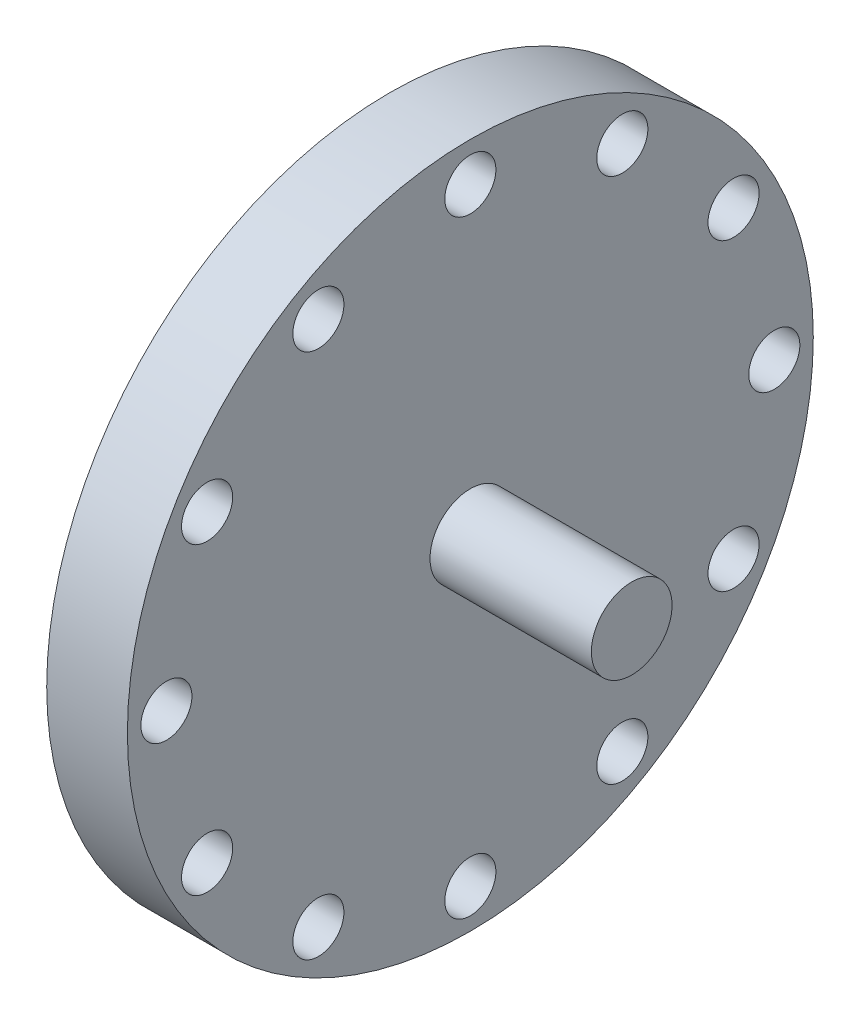
ISO-10303-21;
HEADER;
FILE_DESCRIPTION(('STEP AP214'),'2;1');
FILE_NAME('part.step','',(''),(''),'','','');
FILE_SCHEMA(('AUTOMOTIVE_DESIGN { 1 0 10303 214 1 1 1 1 }'));
ENDSEC;
DATA;
#1=APPLICATION_CONTEXT('core data for automotive mechanical design processes');
#2=APPLICATION_PROTOCOL_DEFINITION('international standard','automotive_design',2000,#1);
#3=PRODUCT_CONTEXT('',#1,'mechanical');
#4=PRODUCT('Part','Part','',(#3));
#5=PRODUCT_RELATED_PRODUCT_CATEGORY('part','',(#4));
#6=PRODUCT_DEFINITION_FORMATION('','',#4);
#7=PRODUCT_DEFINITION_CONTEXT('part definition',#1,'design');
#8=PRODUCT_DEFINITION('design','',#6,#7);
#9=PRODUCT_DEFINITION_SHAPE('','',#8);
#10=(LENGTH_UNIT() NAMED_UNIT(*) SI_UNIT(.MILLI.,.METRE.));
#11=(NAMED_UNIT(*) PLANE_ANGLE_UNIT() SI_UNIT($,.RADIAN.));
#12=(NAMED_UNIT(*) SI_UNIT($,.STERADIAN.) SOLID_ANGLE_UNIT());
#13=UNCERTAINTY_MEASURE_WITH_UNIT(LENGTH_MEASURE(1.E-05),#10,'distance_accuracy_value','');
#14=(GEOMETRIC_REPRESENTATION_CONTEXT(3) GLOBAL_UNCERTAINTY_ASSIGNED_CONTEXT((#13)) GLOBAL_UNIT_ASSIGNED_CONTEXT((#10,
#11,#12)) REPRESENTATION_CONTEXT('',''));
#15=CARTESIAN_POINT('',(0.,0.,0.));
#16=DIRECTION('',(0.,0.,1.));
#17=DIRECTION('',(1.,0.,0.));
#18=AXIS2_PLACEMENT_3D('',#15,#16,#17);
#19=CARTESIAN_POINT('',(0.,0.,0.));
#20=DIRECTION('',(1.,0.,0.));
#21=DIRECTION('',(0.,0.,-1.));
#22=AXIS2_PLACEMENT_3D('',#19,#20,#21);
#23=PLANE('',#22);
#24=CARTESIAN_POINT('',(0.,0.,0.));
#25=DIRECTION('',(-1.,0.,0.));
#26=DIRECTION('',(0.,0.,1.));
#27=AXIS2_PLACEMENT_3D('',#24,#25,#26);
#28=CIRCLE('',#27,20.);
#29=CARTESIAN_POINT('',(0.,0.,20.));
#30=VERTEX_POINT('',#29);
#31=EDGE_CURVE('E10',#30,#30,#28,.T.);
#32=ORIENTED_EDGE('',*,*,#31,.T.);
#33=EDGE_LOOP('',(#32));
#34=FACE_BOUND('',#33,.T.);
#35=ADVANCED_FACE('F37',(#34),#23,.F.);
#36=CARTESIAN_POINT('',(0.,0.,0.));
#37=DIRECTION('',(-1.,0.,0.));
#38=DIRECTION('',(0.,0.,1.));
#39=AXIS2_PLACEMENT_3D('',#36,#37,#38);
#40=CYLINDRICAL_SURFACE('',#39,20.);
#41=ORIENTED_EDGE('',*,*,#31,.F.);
#42=EDGE_LOOP('',(#41));
#43=FACE_BOUND('',#42,.T.);
#44=CARTESIAN_POINT('',(10.,0.,0.));
#45=DIRECTION('',(-1.,0.,0.));
#46=DIRECTION('',(0.,0.,1.));
#47=AXIS2_PLACEMENT_3D('',#44,#45,#46);
#48=CIRCLE('',#47,20.);
#49=CARTESIAN_POINT('',(10.,0.,20.));
#50=VERTEX_POINT('',#49);
#51=EDGE_CURVE('E44',#50,#50,#48,.T.);
#52=ORIENTED_EDGE('',*,*,#51,.T.);
#53=EDGE_LOOP('',(#52));
#54=FACE_BOUND('',#53,.T.);
#55=ADVANCED_FACE('F169',(#43,#54),#40,.T.);
#56=CARTESIAN_POINT('',(10.,20.,0.));
#57=DIRECTION('',(1.,0.,0.));
#58=DIRECTION('',(0.,0.,-1.));
#59=AXIS2_PLACEMENT_3D('',#56,#57,#58);
#60=PLANE('',#59);
#61=CARTESIAN_POINT('',(9.99999999999999,97.8608706276416,-56.5));
#62=DIRECTION('',(1.,0.,0.));
#63=DIRECTION('',(0.,0.,-1.));
#64=AXIS2_PLACEMENT_3D('',#61,#62,#63);
#65=CIRCLE('',#64,9.50000000000001);
#66=CARTESIAN_POINT('',(9.99999999999999,97.8608706276416,-66.));
#67=VERTEX_POINT('',#66);
#68=EDGE_CURVE('E95',#67,#67,#65,.F.);
#69=ORIENTED_EDGE('',*,*,#68,.F.);
#70=EDGE_LOOP('',(#69));
#71=FACE_BOUND('',#70,.T.);
#72=CARTESIAN_POINT('',(9.99999999999999,56.4999999999999,-97.8608706276416));
#73=DIRECTION('',(1.,0.,0.));
#74=DIRECTION('',(0.,0.,-1.));
#75=AXIS2_PLACEMENT_3D('',#72,#73,#74);
#76=CIRCLE('',#75,9.5);
#77=CARTESIAN_POINT('',(9.99999999999999,56.4999999999999,-107.360870627642));
#78=VERTEX_POINT('',#77);
#79=EDGE_CURVE('E92',#78,#78,#76,.F.);
#80=ORIENTED_EDGE('',*,*,#79,.F.);
#81=EDGE_LOOP('',(#80));
#82=FACE_BOUND('',#81,.T.);
#83=CARTESIAN_POINT('',(9.99999999999999,0.,-113.));
#84=DIRECTION('',(1.,0.,0.));
#85=DIRECTION('',(0.,0.,-1.));
#86=AXIS2_PLACEMENT_3D('',#83,#84,#85);
#87=CIRCLE('',#86,9.49999999999999);
#88=CARTESIAN_POINT('',(9.99999999999999,0.,-122.5));
#89=VERTEX_POINT('',#88);
#90=EDGE_CURVE('E89',#89,#89,#87,.F.);
#91=ORIENTED_EDGE('',*,*,#90,.F.);
#92=EDGE_LOOP('',(#91));
#93=FACE_BOUND('',#92,.T.);
#94=CARTESIAN_POINT('',(9.99999999999999,-56.5,-97.8608706276415));
#95=DIRECTION('',(1.,0.,0.));
#96=DIRECTION('',(0.,0.,-1.));
#97=AXIS2_PLACEMENT_3D('',#94,#95,#96);
#98=CIRCLE('',#97,9.5);
#99=CARTESIAN_POINT('',(9.99999999999999,-56.5,-107.360870627642));
#100=VERTEX_POINT('',#99);
#101=EDGE_CURVE('E85',#100,#100,#98,.F.);
#102=ORIENTED_EDGE('',*,*,#101,.F.);
#103=EDGE_LOOP('',(#102));
#104=FACE_BOUND('',#103,.T.);
#105=CARTESIAN_POINT('',(9.99999999999999,-97.8608706276416,-56.5));
#106=DIRECTION('',(1.,0.,0.));
#107=DIRECTION('',(0.,0.,-1.));
#108=AXIS2_PLACEMENT_3D('',#105,#106,#107);
#109=CIRCLE('',#108,9.50000000000001);
#110=CARTESIAN_POINT('',(9.99999999999999,-97.8608706276416,-66.));
#111=VERTEX_POINT('',#110);
#112=EDGE_CURVE('E81',#111,#111,#109,.F.);
#113=ORIENTED_EDGE('',*,*,#112,.F.);
#114=EDGE_LOOP('',(#113));
#115=FACE_BOUND('',#114,.T.);
#116=CARTESIAN_POINT('',(9.99999999999999,-113.,0.));
#117=DIRECTION('',(1.,0.,0.));
#118=DIRECTION('',(0.,0.,-1.));
#119=AXIS2_PLACEMENT_3D('',#116,#117,#118);
#120=CIRCLE('',#119,9.49999999999998);
#121=CARTESIAN_POINT('',(9.99999999999999,-113.,-9.49999999999998));
#122=VERTEX_POINT('',#121);
#123=EDGE_CURVE('E77',#122,#122,#120,.F.);
#124=ORIENTED_EDGE('',*,*,#123,.F.);
#125=EDGE_LOOP('',(#124));
#126=FACE_BOUND('',#125,.T.);
#127=CARTESIAN_POINT('',(9.99999999999999,-97.8608706276415,56.5));
#128=DIRECTION('',(1.,0.,0.));
#129=DIRECTION('',(0.,0.,-1.));
#130=AXIS2_PLACEMENT_3D('',#127,#128,#129);
#131=CIRCLE('',#130,9.5);
#132=CARTESIAN_POINT('',(9.99999999999999,-97.8608706276415,47.));
#133=VERTEX_POINT('',#132);
#134=EDGE_CURVE('E73',#133,#133,#131,.F.);
#135=ORIENTED_EDGE('',*,*,#134,.F.);
#136=EDGE_LOOP('',(#135));
#137=FACE_BOUND('',#136,.T.);
#138=CARTESIAN_POINT('',(9.99999999999999,-56.5,97.8608706276416));
#139=DIRECTION('',(1.,0.,0.));
#140=DIRECTION('',(0.,0.,-1.));
#141=AXIS2_PLACEMENT_3D('',#138,#139,#140);
#142=CIRCLE('',#141,9.5);
#143=CARTESIAN_POINT('',(9.99999999999999,-56.5,88.3608706276416));
#144=VERTEX_POINT('',#143);
#145=EDGE_CURVE('E69',#144,#144,#142,.F.);
#146=ORIENTED_EDGE('',*,*,#145,.F.);
#147=EDGE_LOOP('',(#146));
#148=FACE_BOUND('',#147,.T.);
#149=CARTESIAN_POINT('',(9.99999999999999,0.,113.));
#150=DIRECTION('',(1.,0.,0.));
#151=DIRECTION('',(0.,0.,-1.));
#152=AXIS2_PLACEMENT_3D('',#149,#150,#151);
#153=CIRCLE('',#152,9.49999999999999);
#154=CARTESIAN_POINT('',(9.99999999999999,0.,103.5));
#155=VERTEX_POINT('',#154);
#156=EDGE_CURVE('E65',#155,#155,#153,.F.);
#157=ORIENTED_EDGE('',*,*,#156,.F.);
#158=EDGE_LOOP('',(#157));
#159=FACE_BOUND('',#158,.T.);
#160=CARTESIAN_POINT('',(9.99999999999999,56.5,97.8608706276416));
#161=DIRECTION('',(1.,0.,0.));
#162=DIRECTION('',(0.,0.,-1.));
#163=AXIS2_PLACEMENT_3D('',#160,#161,#162);
#164=CIRCLE('',#163,9.5);
#165=CARTESIAN_POINT('',(9.99999999999999,56.5,88.3608706276416));
#166=VERTEX_POINT('',#165);
#167=EDGE_CURVE('E61',#166,#166,#164,.F.);
#168=ORIENTED_EDGE('',*,*,#167,.F.);
#169=EDGE_LOOP('',(#168));
#170=FACE_BOUND('',#169,.T.);
#171=CARTESIAN_POINT('',(9.99999999999999,97.8608706276416,56.5));
#172=DIRECTION('',(1.,0.,0.));
#173=DIRECTION('',(0.,0.,-1.));
#174=AXIS2_PLACEMENT_3D('',#171,#172,#173);
#175=CIRCLE('',#174,9.5);
#176=CARTESIAN_POINT('',(9.99999999999999,97.8608706276416,47.));
#177=VERTEX_POINT('',#176);
#178=EDGE_CURVE('E57',#177,#177,#175,.F.);
#179=ORIENTED_EDGE('',*,*,#178,.F.);
#180=EDGE_LOOP('',(#179));
#181=FACE_BOUND('',#180,.T.);
#182=CARTESIAN_POINT('',(9.99999999999999,113.,0.));
#183=DIRECTION('',(1.,0.,0.));
#184=DIRECTION('',(0.,0.,-1.));
#185=AXIS2_PLACEMENT_3D('',#182,#183,#184);
#186=CIRCLE('',#185,9.50000000000001);
#187=CARTESIAN_POINT('',(9.99999999999999,113.,-9.50000000000001));
#188=VERTEX_POINT('',#187);
#189=EDGE_CURVE('E56',#188,#188,#186,.F.);
#190=ORIENTED_EDGE('',*,*,#189,.F.);
#191=EDGE_LOOP('',(#190));
#192=FACE_BOUND('',#191,.T.);
#193=ORIENTED_EDGE('',*,*,#51,.F.);
#194=EDGE_LOOP('',(#193));
#195=FACE_BOUND('',#194,.T.);
#196=CARTESIAN_POINT('',(10.,0.,0.));
#197=DIRECTION('',(-1.,0.,0.));
#198=DIRECTION('',(0.,0.,1.));
#199=AXIS2_PLACEMENT_3D('',#196,#197,#198);
#200=CIRCLE('',#199,127.5);
#201=CARTESIAN_POINT('',(10.,0.,127.5));
#202=VERTEX_POINT('',#201);
#203=EDGE_CURVE('E49',#202,#202,#200,.T.);
#204=ORIENTED_EDGE('',*,*,#203,.T.);
#205=EDGE_LOOP('',(#204));
#206=FACE_BOUND('',#205,.T.);
#207=ADVANCED_FACE('F137',(#71,#82,#93,#104,#115,#126,#137,#148,#159,#170,#181,#192,#195,#206),
#60,.F.);
#208=CARTESIAN_POINT('',(0.,0.,0.));
#209=DIRECTION('',(-1.,0.,0.));
#210=DIRECTION('',(0.,0.,1.));
#211=AXIS2_PLACEMENT_3D('',#208,#209,#210);
#212=CYLINDRICAL_SURFACE('',#211,127.5);
#213=ORIENTED_EDGE('',*,*,#203,.F.);
#214=EDGE_LOOP('',(#213));
#215=FACE_BOUND('',#214,.T.);
#216=CARTESIAN_POINT('',(40.,0.,0.));
#217=DIRECTION('',(-1.,0.,0.));
#218=DIRECTION('',(0.,0.,1.));
#219=AXIS2_PLACEMENT_3D('',#216,#217,#218);
#220=CIRCLE('',#219,127.5);
#221=CARTESIAN_POINT('',(40.,0.,127.5));
#222=VERTEX_POINT('',#221);
#223=EDGE_CURVE('E132',#222,#222,#220,.T.);
#224=ORIENTED_EDGE('',*,*,#223,.T.);
#225=EDGE_LOOP('',(#224));
#226=FACE_BOUND('',#225,.T.);
#227=ADVANCED_FACE('F139',(#215,#226),#212,.T.);
#228=CARTESIAN_POINT('',(40.,127.5,0.));
#229=DIRECTION('',(-1.,0.,0.));
#230=DIRECTION('',(0.,0.,1.));
#231=AXIS2_PLACEMENT_3D('',#228,#229,#230);
#232=PLANE('',#231);
#233=CARTESIAN_POINT('',(40.,97.8608706276416,-56.5));
#234=DIRECTION('',(-1.,0.,0.));
#235=DIRECTION('',(0.,0.,1.));
#236=AXIS2_PLACEMENT_3D('',#233,#234,#235);
#237=CIRCLE('',#236,9.50000000000001);
#238=CARTESIAN_POINT('',(40.,97.8608706276416,-47.));
#239=VERTEX_POINT('',#238);
#240=EDGE_CURVE('E40',#239,#239,#237,.F.);
#241=ORIENTED_EDGE('',*,*,#240,.F.);
#242=EDGE_LOOP('',(#241));
#243=FACE_BOUND('',#242,.T.);
#244=CARTESIAN_POINT('',(40.,56.4999999999999,-97.8608706276416));
#245=DIRECTION('',(-1.,0.,0.));
#246=DIRECTION('',(0.,0.,1.));
#247=AXIS2_PLACEMENT_3D('',#244,#245,#246);
#248=CIRCLE('',#247,9.5);
#249=CARTESIAN_POINT('',(40.,56.4999999999999,-88.3608706276416));
#250=VERTEX_POINT('',#249);
#251=EDGE_CURVE('E93',#250,#250,#248,.F.);
#252=ORIENTED_EDGE('',*,*,#251,.F.);
#253=EDGE_LOOP('',(#252));
#254=FACE_BOUND('',#253,.T.);
#255=CARTESIAN_POINT('',(40.,0.,-113.));
#256=DIRECTION('',(-1.,0.,0.));
#257=DIRECTION('',(0.,0.,1.));
#258=AXIS2_PLACEMENT_3D('',#255,#256,#257);
#259=CIRCLE('',#258,9.49999999999999);
#260=CARTESIAN_POINT('',(40.,0.,-103.5));
#261=VERTEX_POINT('',#260);
#262=EDGE_CURVE('E90',#261,#261,#259,.F.);
#263=ORIENTED_EDGE('',*,*,#262,.F.);
#264=EDGE_LOOP('',(#263));
#265=FACE_BOUND('',#264,.T.);
#266=CARTESIAN_POINT('',(40.,-56.5,-97.8608706276415));
#267=DIRECTION('',(-1.,0.,0.));
#268=DIRECTION('',(0.,0.,1.));
#269=AXIS2_PLACEMENT_3D('',#266,#267,#268);
#270=CIRCLE('',#269,9.5);
#271=CARTESIAN_POINT('',(40.,-56.5,-88.3608706276415));
#272=VERTEX_POINT('',#271);
#273=EDGE_CURVE('E86',#272,#272,#270,.F.);
#274=ORIENTED_EDGE('',*,*,#273,.F.);
#275=EDGE_LOOP('',(#274));
#276=FACE_BOUND('',#275,.T.);
#277=CARTESIAN_POINT('',(40.,-97.8608706276416,-56.5));
#278=DIRECTION('',(-1.,0.,0.));
#279=DIRECTION('',(0.,0.,1.));
#280=AXIS2_PLACEMENT_3D('',#277,#278,#279);
#281=CIRCLE('',#280,9.50000000000001);
#282=CARTESIAN_POINT('',(40.,-97.8608706276416,-47.));
#283=VERTEX_POINT('',#282);
#284=EDGE_CURVE('E82',#283,#283,#281,.F.);
#285=ORIENTED_EDGE('',*,*,#284,.F.);
#286=EDGE_LOOP('',(#285));
#287=FACE_BOUND('',#286,.T.);
#288=CARTESIAN_POINT('',(40.,-113.,0.));
#289=DIRECTION('',(-1.,0.,0.));
#290=DIRECTION('',(0.,0.,1.));
#291=AXIS2_PLACEMENT_3D('',#288,#289,#290);
#292=CIRCLE('',#291,9.49999999999998);
#293=CARTESIAN_POINT('',(40.,-113.,9.49999999999998));
#294=VERTEX_POINT('',#293);
#295=EDGE_CURVE('E78',#294,#294,#292,.F.);
#296=ORIENTED_EDGE('',*,*,#295,.F.);
#297=EDGE_LOOP('',(#296));
#298=FACE_BOUND('',#297,.T.);
#299=CARTESIAN_POINT('',(40.,-97.8608706276415,56.5));
#300=DIRECTION('',(-1.,0.,0.));
#301=DIRECTION('',(0.,0.,1.));
#302=AXIS2_PLACEMENT_3D('',#299,#300,#301);
#303=CIRCLE('',#302,9.5);
#304=CARTESIAN_POINT('',(40.,-97.8608706276415,66.));
#305=VERTEX_POINT('',#304);
#306=EDGE_CURVE('E74',#305,#305,#303,.F.);
#307=ORIENTED_EDGE('',*,*,#306,.F.);
#308=EDGE_LOOP('',(#307));
#309=FACE_BOUND('',#308,.T.);
#310=CARTESIAN_POINT('',(40.,-56.5,97.8608706276416));
#311=DIRECTION('',(-1.,0.,0.));
#312=DIRECTION('',(0.,0.,1.));
#313=AXIS2_PLACEMENT_3D('',#310,#311,#312);
#314=CIRCLE('',#313,9.5);
#315=CARTESIAN_POINT('',(40.,-56.5,107.360870627642));
#316=VERTEX_POINT('',#315);
#317=EDGE_CURVE('E70',#316,#316,#314,.F.);
#318=ORIENTED_EDGE('',*,*,#317,.F.);
#319=EDGE_LOOP('',(#318));
#320=FACE_BOUND('',#319,.T.);
#321=CARTESIAN_POINT('',(40.,0.,113.));
#322=DIRECTION('',(-1.,0.,0.));
#323=DIRECTION('',(0.,0.,1.));
#324=AXIS2_PLACEMENT_3D('',#321,#322,#323);
#325=CIRCLE('',#324,9.49999999999999);
#326=CARTESIAN_POINT('',(40.,0.,122.5));
#327=VERTEX_POINT('',#326);
#328=EDGE_CURVE('E66',#327,#327,#325,.F.);
#329=ORIENTED_EDGE('',*,*,#328,.F.);
#330=EDGE_LOOP('',(#329));
#331=FACE_BOUND('',#330,.T.);
#332=CARTESIAN_POINT('',(40.,56.5,97.8608706276416));
#333=DIRECTION('',(-1.,0.,0.));
#334=DIRECTION('',(0.,0.,1.));
#335=AXIS2_PLACEMENT_3D('',#332,#333,#334);
#336=CIRCLE('',#335,9.5);
#337=CARTESIAN_POINT('',(40.,56.5,107.360870627642));
#338=VERTEX_POINT('',#337);
#339=EDGE_CURVE('E62',#338,#338,#336,.F.);
#340=ORIENTED_EDGE('',*,*,#339,.F.);
#341=EDGE_LOOP('',(#340));
#342=FACE_BOUND('',#341,.T.);
#343=CARTESIAN_POINT('',(40.,97.8608706276416,56.5));
#344=DIRECTION('',(-1.,0.,0.));
#345=DIRECTION('',(0.,0.,1.));
#346=AXIS2_PLACEMENT_3D('',#343,#344,#345);
#347=CIRCLE('',#346,9.5);
#348=CARTESIAN_POINT('',(40.,97.8608706276416,66.));
#349=VERTEX_POINT('',#348);
#350=EDGE_CURVE('E58',#349,#349,#347,.F.);
#351=ORIENTED_EDGE('',*,*,#350,.F.);
#352=EDGE_LOOP('',(#351));
#353=FACE_BOUND('',#352,.T.);
#354=CARTESIAN_POINT('',(40.,113.,0.));
#355=DIRECTION('',(-1.,0.,0.));
#356=DIRECTION('',(0.,0.,1.));
#357=AXIS2_PLACEMENT_3D('',#354,#355,#356);
#358=CIRCLE('',#357,9.50000000000001);
#359=CARTESIAN_POINT('',(40.,113.,9.50000000000001));
#360=VERTEX_POINT('',#359);
#361=EDGE_CURVE('E53',#360,#360,#358,.F.);
#362=ORIENTED_EDGE('',*,*,#361,.F.);
#363=EDGE_LOOP('',(#362));
#364=FACE_BOUND('',#363,.T.);
#365=ORIENTED_EDGE('',*,*,#223,.F.);
#366=EDGE_LOOP('',(#365));
#367=FACE_BOUND('',#366,.T.);
#368=CARTESIAN_POINT('',(40.,0.,0.));
#369=DIRECTION('',(-1.,0.,0.));
#370=DIRECTION('',(0.,0.,1.));
#371=AXIS2_PLACEMENT_3D('',#368,#369,#370);
#372=CIRCLE('',#371,15.);
#373=CARTESIAN_POINT('',(40.,0.,15.));
#374=VERTEX_POINT('',#373);
#375=EDGE_CURVE('E129',#374,#374,#372,.T.);
#376=ORIENTED_EDGE('',*,*,#375,.T.);
#377=EDGE_LOOP('',(#376));
#378=FACE_BOUND('',#377,.T.);
#379=ADVANCED_FACE('F142',(#243,#254,#265,#276,#287,#298,#309,#320,#331,#342,#353,#364,#367,
#378),#232,.F.);
#380=CARTESIAN_POINT('',(0.,0.,0.));
#381=DIRECTION('',(-1.,0.,0.));
#382=DIRECTION('',(0.,0.,1.));
#383=AXIS2_PLACEMENT_3D('',#380,#381,#382);
#384=CYLINDRICAL_SURFACE('',#383,15.);
#385=ORIENTED_EDGE('',*,*,#375,.F.);
#386=EDGE_LOOP('',(#385));
#387=FACE_BOUND('',#386,.T.);
#388=CARTESIAN_POINT('',(100.,0.,0.));
#389=DIRECTION('',(-1.,0.,0.));
#390=DIRECTION('',(0.,0.,1.));
#391=AXIS2_PLACEMENT_3D('',#388,#389,#390);
#392=CIRCLE('',#391,15.);
#393=CARTESIAN_POINT('',(100.,0.,15.));
#394=VERTEX_POINT('',#393);
#395=EDGE_CURVE('E126',#394,#394,#392,.T.);
#396=ORIENTED_EDGE('',*,*,#395,.T.);
#397=EDGE_LOOP('',(#396));
#398=FACE_BOUND('',#397,.T.);
#399=ADVANCED_FACE('F148',(#387,#398),#384,.T.);
#400=CARTESIAN_POINT('',(100.,0.,0.));
#401=DIRECTION('',(-1.,0.,0.));
#402=DIRECTION('',(0.,0.,1.));
#403=AXIS2_PLACEMENT_3D('',#400,#401,#402);
#404=PLANE('',#403);
#405=ORIENTED_EDGE('',*,*,#395,.F.);
#406=EDGE_LOOP('',(#405));
#407=FACE_BOUND('',#406,.T.);
#408=ADVANCED_FACE('F155',(#407),#404,.F.);
#409=CARTESIAN_POINT('',(100.,113.,0.));
#410=DIRECTION('',(-1.,0.,0.));
#411=DIRECTION('',(0.,0.,1.));
#412=AXIS2_PLACEMENT_3D('',#409,#410,#411);
#413=CYLINDRICAL_SURFACE('',#412,9.50000000000001);
#414=ORIENTED_EDGE('',*,*,#361,.T.);
#415=EDGE_LOOP('',(#414));
#416=FACE_BOUND('',#415,.T.);
#417=ORIENTED_EDGE('',*,*,#189,.T.);
#418=EDGE_LOOP('',(#417));
#419=FACE_BOUND('',#418,.T.);
#420=ADVANCED_FACE('F160',(#416,#419),#413,.F.);
#421=CARTESIAN_POINT('',(100.,97.8608706276416,56.5));
#422=DIRECTION('',(-1.,0.,0.));
#423=DIRECTION('',(0.,0.,1.));
#424=AXIS2_PLACEMENT_3D('',#421,#422,#423);
#425=CYLINDRICAL_SURFACE('',#424,9.5);
#426=ORIENTED_EDGE('',*,*,#350,.T.);
#427=EDGE_LOOP('',(#426));
#428=FACE_BOUND('',#427,.T.);
#429=ORIENTED_EDGE('',*,*,#178,.T.);
#430=EDGE_LOOP('',(#429));
#431=FACE_BOUND('',#430,.T.);
#432=ADVANCED_FACE('F165',(#428,#431),#425,.F.);
#433=CARTESIAN_POINT('',(100.,56.5,97.8608706276416));
#434=DIRECTION('',(-1.,0.,0.));
#435=DIRECTION('',(0.,0.,1.));
#436=AXIS2_PLACEMENT_3D('',#433,#434,#435);
#437=CYLINDRICAL_SURFACE('',#436,9.5);
#438=ORIENTED_EDGE('',*,*,#339,.T.);
#439=EDGE_LOOP('',(#438));
#440=FACE_BOUND('',#439,.T.);
#441=ORIENTED_EDGE('',*,*,#167,.T.);
#442=EDGE_LOOP('',(#441));
#443=FACE_BOUND('',#442,.T.);
#444=ADVANCED_FACE('F210',(#440,#443),#437,.F.);
#445=CARTESIAN_POINT('',(100.,0.,113.));
#446=DIRECTION('',(-1.,0.,0.));
#447=DIRECTION('',(0.,0.,1.));
#448=AXIS2_PLACEMENT_3D('',#445,#446,#447);
#449=CYLINDRICAL_SURFACE('',#448,9.49999999999999);
#450=ORIENTED_EDGE('',*,*,#328,.T.);
#451=EDGE_LOOP('',(#450));
#452=FACE_BOUND('',#451,.T.);
#453=ORIENTED_EDGE('',*,*,#156,.T.);
#454=EDGE_LOOP('',(#453));
#455=FACE_BOUND('',#454,.T.);
#456=ADVANCED_FACE('F216',(#452,#455),#449,.F.);
#457=CARTESIAN_POINT('',(100.,-56.5,97.8608706276416));
#458=DIRECTION('',(-1.,0.,0.));
#459=DIRECTION('',(0.,0.,1.));
#460=AXIS2_PLACEMENT_3D('',#457,#458,#459);
#461=CYLINDRICAL_SURFACE('',#460,9.5);
#462=ORIENTED_EDGE('',*,*,#317,.T.);
#463=EDGE_LOOP('',(#462));
#464=FACE_BOUND('',#463,.T.);
#465=ORIENTED_EDGE('',*,*,#145,.T.);
#466=EDGE_LOOP('',(#465));
#467=FACE_BOUND('',#466,.T.);
#468=ADVANCED_FACE('F222',(#464,#467),#461,.F.);
#469=CARTESIAN_POINT('',(100.,-97.8608706276415,56.5));
#470=DIRECTION('',(-1.,0.,0.));
#471=DIRECTION('',(0.,0.,1.));
#472=AXIS2_PLACEMENT_3D('',#469,#470,#471);
#473=CYLINDRICAL_SURFACE('',#472,9.5);
#474=ORIENTED_EDGE('',*,*,#306,.T.);
#475=EDGE_LOOP('',(#474));
#476=FACE_BOUND('',#475,.T.);
#477=ORIENTED_EDGE('',*,*,#134,.T.);
#478=EDGE_LOOP('',(#477));
#479=FACE_BOUND('',#478,.T.);
#480=ADVANCED_FACE('F226',(#476,#479),#473,.F.);
#481=CARTESIAN_POINT('',(100.,-113.,0.));
#482=DIRECTION('',(-1.,0.,0.));
#483=DIRECTION('',(0.,0.,1.));
#484=AXIS2_PLACEMENT_3D('',#481,#482,#483);
#485=CYLINDRICAL_SURFACE('',#484,9.49999999999998);
#486=ORIENTED_EDGE('',*,*,#295,.T.);
#487=EDGE_LOOP('',(#486));
#488=FACE_BOUND('',#487,.T.);
#489=ORIENTED_EDGE('',*,*,#123,.T.);
#490=EDGE_LOOP('',(#489));
#491=FACE_BOUND('',#490,.T.);
#492=ADVANCED_FACE('F230',(#488,#491),#485,.F.);
#493=CARTESIAN_POINT('',(100.,-97.8608706276416,-56.5));
#494=DIRECTION('',(-1.,0.,0.));
#495=DIRECTION('',(0.,0.,1.));
#496=AXIS2_PLACEMENT_3D('',#493,#494,#495);
#497=CYLINDRICAL_SURFACE('',#496,9.50000000000001);
#498=ORIENTED_EDGE('',*,*,#284,.T.);
#499=EDGE_LOOP('',(#498));
#500=FACE_BOUND('',#499,.T.);
#501=ORIENTED_EDGE('',*,*,#112,.T.);
#502=EDGE_LOOP('',(#501));
#503=FACE_BOUND('',#502,.T.);
#504=ADVANCED_FACE('F234',(#500,#503),#497,.F.);
#505=CARTESIAN_POINT('',(100.,-56.5,-97.8608706276415));
#506=DIRECTION('',(-1.,0.,0.));
#507=DIRECTION('',(0.,0.,1.));
#508=AXIS2_PLACEMENT_3D('',#505,#506,#507);
#509=CYLINDRICAL_SURFACE('',#508,9.5);
#510=ORIENTED_EDGE('',*,*,#273,.T.);
#511=EDGE_LOOP('',(#510));
#512=FACE_BOUND('',#511,.T.);
#513=ORIENTED_EDGE('',*,*,#101,.T.);
#514=EDGE_LOOP('',(#513));
#515=FACE_BOUND('',#514,.T.);
#516=ADVANCED_FACE('F238',(#512,#515),#509,.F.);
#517=CARTESIAN_POINT('',(100.,0.,-113.));
#518=DIRECTION('',(-1.,0.,0.));
#519=DIRECTION('',(0.,0.,1.));
#520=AXIS2_PLACEMENT_3D('',#517,#518,#519);
#521=CYLINDRICAL_SURFACE('',#520,9.49999999999999);
#522=ORIENTED_EDGE('',*,*,#262,.T.);
#523=EDGE_LOOP('',(#522));
#524=FACE_BOUND('',#523,.T.);
#525=ORIENTED_EDGE('',*,*,#90,.T.);
#526=EDGE_LOOP('',(#525));
#527=FACE_BOUND('',#526,.T.);
#528=ADVANCED_FACE('F242',(#524,#527),#521,.F.);
#529=CARTESIAN_POINT('',(100.,56.4999999999999,-97.8608706276416));
#530=DIRECTION('',(-1.,0.,0.));
#531=DIRECTION('',(0.,0.,1.));
#532=AXIS2_PLACEMENT_3D('',#529,#530,#531);
#533=CYLINDRICAL_SURFACE('',#532,9.5);
#534=ORIENTED_EDGE('',*,*,#251,.T.);
#535=EDGE_LOOP('',(#534));
#536=FACE_BOUND('',#535,.T.);
#537=ORIENTED_EDGE('',*,*,#79,.T.);
#538=EDGE_LOOP('',(#537));
#539=FACE_BOUND('',#538,.T.);
#540=ADVANCED_FACE('F246',(#536,#539),#533,.F.);
#541=CARTESIAN_POINT('',(100.,97.8608706276416,-56.5));
#542=DIRECTION('',(-1.,0.,0.));
#543=DIRECTION('',(0.,0.,1.));
#544=AXIS2_PLACEMENT_3D('',#541,#542,#543);
#545=CYLINDRICAL_SURFACE('',#544,9.50000000000001);
#546=ORIENTED_EDGE('',*,*,#240,.T.);
#547=EDGE_LOOP('',(#546));
#548=FACE_BOUND('',#547,.T.);
#549=ORIENTED_EDGE('',*,*,#68,.T.);
#550=EDGE_LOOP('',(#549));
#551=FACE_BOUND('',#550,.T.);
#552=ADVANCED_FACE('F249',(#548,#551),#545,.F.);
#553=CLOSED_SHELL('',(#35,#55,#207,#227,#379,#399,#408,#420,#432,#444,#456,#468,#480,#492,#504,
#516,#528,#540,#552));
#554=MANIFOLD_SOLID_BREP('B2',#553);
#555=ADVANCED_BREP_SHAPE_REPRESENTATION('',(#18,#554),#14);
#556=SHAPE_DEFINITION_REPRESENTATION(#9,#555);
ENDSEC;
END-ISO-10303-21;
